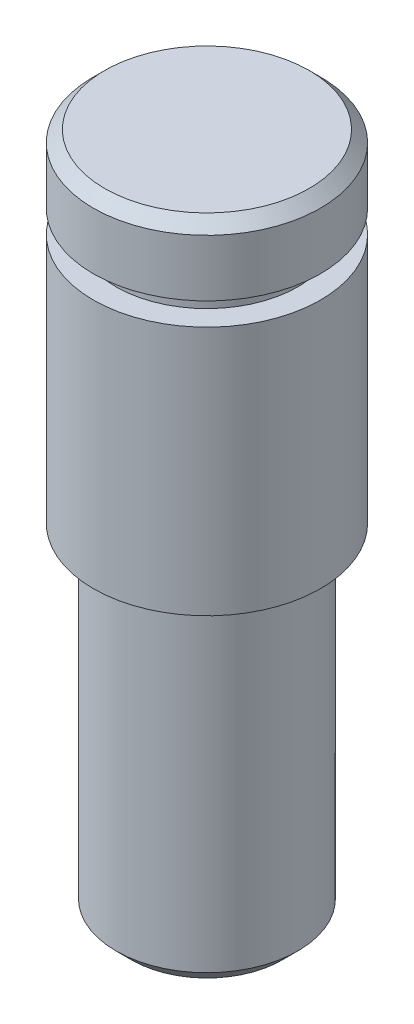
ISO-10303-21;
HEADER;
FILE_DESCRIPTION(('STEP AP214'),'2;1');
FILE_NAME('part.step','',(''),(''),'','','');
FILE_SCHEMA(('AUTOMOTIVE_DESIGN { 1 0 10303 214 1 1 1 1 }'));
ENDSEC;
DATA;
#1=APPLICATION_CONTEXT('core data for automotive mechanical design processes');
#2=APPLICATION_PROTOCOL_DEFINITION('international standard','automotive_design',2000,#1);
#3=PRODUCT_CONTEXT('',#1,'mechanical');
#4=PRODUCT('Part','Part','',(#3));
#5=PRODUCT_RELATED_PRODUCT_CATEGORY('part','',(#4));
#6=PRODUCT_DEFINITION_FORMATION('','',#4);
#7=PRODUCT_DEFINITION_CONTEXT('part definition',#1,'design');
#8=PRODUCT_DEFINITION('design','',#6,#7);
#9=PRODUCT_DEFINITION_SHAPE('','',#8);
#10=(LENGTH_UNIT() NAMED_UNIT(*) SI_UNIT(.MILLI.,.METRE.));
#11=(NAMED_UNIT(*) PLANE_ANGLE_UNIT() SI_UNIT($,.RADIAN.));
#12=(NAMED_UNIT(*) SI_UNIT($,.STERADIAN.) SOLID_ANGLE_UNIT());
#13=UNCERTAINTY_MEASURE_WITH_UNIT(LENGTH_MEASURE(1.E-05),#10,'distance_accuracy_value','');
#14=(GEOMETRIC_REPRESENTATION_CONTEXT(3) GLOBAL_UNCERTAINTY_ASSIGNED_CONTEXT((#13)) GLOBAL_UNIT_ASSIGNED_CONTEXT((#10,
#11,#12)) REPRESENTATION_CONTEXT('',''));
#15=CARTESIAN_POINT('',(0.,0.,0.));
#16=DIRECTION('',(0.,0.,1.));
#17=DIRECTION('',(1.,0.,0.));
#18=AXIS2_PLACEMENT_3D('',#15,#16,#17);
#19=CARTESIAN_POINT('',(0.,30.,0.));
#20=DIRECTION('',(0.,-1.,0.));
#21=DIRECTION('',(0.,0.,-1.));
#22=AXIS2_PLACEMENT_3D('',#19,#20,#21);
#23=CYLINDRICAL_SURFACE('',#22,5.);
#24=CARTESIAN_POINT('',(0.,27.,0.));
#25=DIRECTION('',(0.,1.,0.));
#26=DIRECTION('',(0.,0.,1.));
#27=AXIS2_PLACEMENT_3D('',#24,#25,#26);
#28=CIRCLE('',#27,5.);
#29=CARTESIAN_POINT('',(0.,27.,5.));
#30=VERTEX_POINT('',#29);
#31=EDGE_CURVE('E63',#30,#30,#28,.T.);
#32=ORIENTED_EDGE('',*,*,#31,.T.);
#33=EDGE_LOOP('',(#32));
#34=FACE_BOUND('',#33,.T.);
#35=CARTESIAN_POINT('',(0.,29.5,0.));
#36=DIRECTION('',(0.,1.,0.));
#37=DIRECTION('',(0.,0.,1.));
#38=AXIS2_PLACEMENT_3D('',#35,#36,#37);
#39=CIRCLE('',#38,5.);
#40=CARTESIAN_POINT('',(0.,29.5,5.));
#41=VERTEX_POINT('',#40);
#42=EDGE_CURVE('E10',#41,#41,#39,.F.);
#43=ORIENTED_EDGE('',*,*,#42,.T.);
#44=EDGE_LOOP('',(#43));
#45=FACE_BOUND('',#44,.T.);
#46=ADVANCED_FACE('F44',(#34,#45),#23,.T.);
#47=CARTESIAN_POINT('',(0.,30.,0.));
#48=DIRECTION('',(0.,1.,0.));
#49=DIRECTION('',(0.,0.,1.));
#50=AXIS2_PLACEMENT_3D('',#47,#48,#49);
#51=PLANE('',#50);
#52=CARTESIAN_POINT('',(0.,30.,0.));
#53=DIRECTION('',(0.,1.,0.));
#54=DIRECTION('',(0.,0.,1.));
#55=AXIS2_PLACEMENT_3D('',#52,#53,#54);
#56=CIRCLE('',#55,4.5);
#57=CARTESIAN_POINT('',(0.,30.,4.5));
#58=VERTEX_POINT('',#57);
#59=EDGE_CURVE('E54',#58,#58,#56,.T.);
#60=ORIENTED_EDGE('',*,*,#59,.T.);
#61=EDGE_LOOP('',(#60));
#62=FACE_BOUND('',#61,.T.);
#63=ADVANCED_FACE('F116',(#62),#51,.T.);
#64=CARTESIAN_POINT('',(0.,30.,0.));
#65=DIRECTION('',(0.,-1.,0.));
#66=DIRECTION('',(0.,0.,-1.));
#67=AXIS2_PLACEMENT_3D('',#64,#65,#66);
#68=CONICAL_SURFACE('',#67,4.5,0.78539816339745);
#69=ORIENTED_EDGE('',*,*,#42,.F.);
#70=EDGE_LOOP('',(#69));
#71=FACE_BOUND('',#70,.T.);
#72=ORIENTED_EDGE('',*,*,#59,.F.);
#73=EDGE_LOOP('',(#72));
#74=FACE_BOUND('',#73,.T.);
#75=ADVANCED_FACE('F47',(#71,#74),#68,.T.);
#76=CARTESIAN_POINT('',(0.,26.,0.));
#77=DIRECTION('',(0.,1.,0.));
#78=DIRECTION('',(0.,0.,1.));
#79=AXIS2_PLACEMENT_3D('',#76,#77,#78);
#80=PLANE('',#79);
#81=CARTESIAN_POINT('',(0.,26.,0.));
#82=DIRECTION('',(0.,1.,0.));
#83=DIRECTION('',(0.,0.,1.));
#84=AXIS2_PLACEMENT_3D('',#81,#82,#83);
#85=CIRCLE('',#84,4.);
#86=CARTESIAN_POINT('',(0.,26.,4.));
#87=VERTEX_POINT('',#86);
#88=EDGE_CURVE('E66',#87,#87,#85,.T.);
#89=ORIENTED_EDGE('',*,*,#88,.F.);
#90=EDGE_LOOP('',(#89));
#91=FACE_BOUND('',#90,.T.);
#92=CARTESIAN_POINT('',(0.,26.,0.));
#93=DIRECTION('',(0.,1.,0.));
#94=DIRECTION('',(0.,0.,1.));
#95=AXIS2_PLACEMENT_3D('',#92,#93,#94);
#96=CIRCLE('',#95,5.);
#97=CARTESIAN_POINT('',(0.,26.,5.));
#98=VERTEX_POINT('',#97);
#99=EDGE_CURVE('E49',#98,#98,#96,.T.);
#100=ORIENTED_EDGE('',*,*,#99,.T.);
#101=EDGE_LOOP('',(#100));
#102=FACE_BOUND('',#101,.T.);
#103=ADVANCED_FACE('F137',(#91,#102),#80,.T.);
#104=CARTESIAN_POINT('',(0.,27.,0.));
#105=DIRECTION('',(0.,1.,0.));
#106=DIRECTION('',(0.,0.,1.));
#107=AXIS2_PLACEMENT_3D('',#104,#105,#106);
#108=PLANE('',#107);
#109=CARTESIAN_POINT('',(0.,27.,0.));
#110=DIRECTION('',(0.,1.,0.));
#111=DIRECTION('',(0.,0.,1.));
#112=AXIS2_PLACEMENT_3D('',#109,#110,#111);
#113=CIRCLE('',#112,4.);
#114=CARTESIAN_POINT('',(0.,27.,4.));
#115=VERTEX_POINT('',#114);
#116=EDGE_CURVE('E76',#115,#115,#113,.T.);
#117=ORIENTED_EDGE('',*,*,#116,.T.);
#118=EDGE_LOOP('',(#117));
#119=FACE_BOUND('',#118,.T.);
#120=ORIENTED_EDGE('',*,*,#31,.F.);
#121=EDGE_LOOP('',(#120));
#122=FACE_BOUND('',#121,.T.);
#123=ADVANCED_FACE('F131',(#119,#122),#108,.F.);
#124=CARTESIAN_POINT('',(0.,26.,0.));
#125=DIRECTION('',(0.,1.,0.));
#126=DIRECTION('',(0.,0.,1.));
#127=AXIS2_PLACEMENT_3D('',#124,#125,#126);
#128=CYLINDRICAL_SURFACE('',#127,4.);
#129=ORIENTED_EDGE('',*,*,#88,.T.);
#130=EDGE_LOOP('',(#129));
#131=FACE_BOUND('',#130,.T.);
#132=ORIENTED_EDGE('',*,*,#116,.F.);
#133=EDGE_LOOP('',(#132));
#134=FACE_BOUND('',#133,.T.);
#135=ADVANCED_FACE('F123',(#131,#134),#128,.T.);
#136=CARTESIAN_POINT('',(0.,15.,0.));
#137=DIRECTION('',(0.,1.,0.));
#138=DIRECTION('',(0.,0.,1.));
#139=AXIS2_PLACEMENT_3D('',#136,#137,#138);
#140=CIRCLE('',#139,5.);
#141=CARTESIAN_POINT('',(0.,15.,5.));
#142=VERTEX_POINT('',#141);
#143=EDGE_CURVE('E86',#142,#142,#140,.T.);
#144=ORIENTED_EDGE('',*,*,#143,.T.);
#145=EDGE_LOOP('',(#144));
#146=FACE_BOUND('',#145,.T.);
#147=ORIENTED_EDGE('',*,*,#99,.F.);
#148=EDGE_LOOP('',(#147));
#149=FACE_BOUND('',#148,.T.);
#150=ADVANCED_FACE('F117',(#146,#149),#23,.T.);
#151=CARTESIAN_POINT('',(0.,0.,0.));
#152=DIRECTION('',(0.,1.,0.));
#153=DIRECTION('',(0.,0.,1.));
#154=AXIS2_PLACEMENT_3D('',#151,#152,#153);
#155=CYLINDRICAL_SURFACE('',#154,4.);
#156=CARTESIAN_POINT('',(0.,15.,0.));
#157=DIRECTION('',(0.,1.,0.));
#158=DIRECTION('',(0.,0.,1.));
#159=AXIS2_PLACEMENT_3D('',#156,#157,#158);
#160=CIRCLE('',#159,4.);
#161=CARTESIAN_POINT('',(0.,15.,4.));
#162=VERTEX_POINT('',#161);
#163=EDGE_CURVE('E82',#162,#162,#160,.T.);
#164=ORIENTED_EDGE('',*,*,#163,.F.);
#165=EDGE_LOOP('',(#164));
#166=FACE_BOUND('',#165,.T.);
#167=CARTESIAN_POINT('',(0.,0.690499999999985,0.));
#168=DIRECTION('',(0.,1.,0.));
#169=DIRECTION('',(0.,0.,1.));
#170=AXIS2_PLACEMENT_3D('',#167,#168,#169);
#171=CIRCLE('',#170,3.99999999999999);
#172=CARTESIAN_POINT('',(0.,0.690499999999985,3.99999999999999));
#173=VERTEX_POINT('',#172);
#174=EDGE_CURVE('E94',#173,#173,#171,.T.);
#175=ORIENTED_EDGE('',*,*,#174,.T.);
#176=EDGE_LOOP('',(#175));
#177=FACE_BOUND('',#176,.T.);
#178=ADVANCED_FACE('F100',(#166,#177),#155,.T.);
#179=CARTESIAN_POINT('',(4.,15.,0.));
#180=DIRECTION('',(0.,1.,0.));
#181=DIRECTION('',(0.,0.,1.));
#182=AXIS2_PLACEMENT_3D('',#179,#180,#181);
#183=PLANE('',#182);
#184=ORIENTED_EDGE('',*,*,#143,.F.);
#185=EDGE_LOOP('',(#184));
#186=FACE_BOUND('',#185,.T.);
#187=ORIENTED_EDGE('',*,*,#163,.T.);
#188=EDGE_LOOP('',(#187));
#189=FACE_BOUND('',#188,.T.);
#190=ADVANCED_FACE('F106',(#186,#189),#183,.F.);
#191=CARTESIAN_POINT('',(0.,0.,0.));
#192=DIRECTION('',(0.,1.,0.));
#193=DIRECTION('',(0.,0.,1.));
#194=AXIS2_PLACEMENT_3D('',#191,#192,#193);
#195=CONICAL_SURFACE('',#194,3.3095,0.785398163397455);
#196=ORIENTED_EDGE('',*,*,#174,.F.);
#197=EDGE_LOOP('',(#196));
#198=FACE_BOUND('',#197,.T.);
#199=CARTESIAN_POINT('',(0.,0.,0.));
#200=DIRECTION('',(0.,1.,0.));
#201=DIRECTION('',(0.,0.,1.));
#202=AXIS2_PLACEMENT_3D('',#199,#200,#201);
#203=CIRCLE('',#202,3.3095);
#204=CARTESIAN_POINT('',(0.,0.,3.3095));
#205=VERTEX_POINT('',#204);
#206=EDGE_CURVE('E90',#205,#205,#203,.T.);
#207=ORIENTED_EDGE('',*,*,#206,.T.);
#208=EDGE_LOOP('',(#207));
#209=FACE_BOUND('',#208,.T.);
#210=ADVANCED_FACE('F102',(#198,#209),#195,.T.);
#211=CARTESIAN_POINT('',(0.,0.,0.));
#212=DIRECTION('',(0.,1.,0.));
#213=DIRECTION('',(0.,0.,1.));
#214=AXIS2_PLACEMENT_3D('',#211,#212,#213);
#215=PLANE('',#214);
#216=ORIENTED_EDGE('',*,*,#206,.F.);
#217=EDGE_LOOP('',(#216));
#218=FACE_BOUND('',#217,.T.);
#219=ADVANCED_FACE('F105',(#218),#215,.F.);
#220=CLOSED_SHELL('',(#46,#63,#75,#103,#123,#135,#150,#178,#190,#210,#219));
#221=MANIFOLD_SOLID_BREP('B2',#220);
#222=ADVANCED_BREP_SHAPE_REPRESENTATION('',(#18,#221),#14);
#223=SHAPE_DEFINITION_REPRESENTATION(#9,#222);
ENDSEC;
END-ISO-10303-21;
